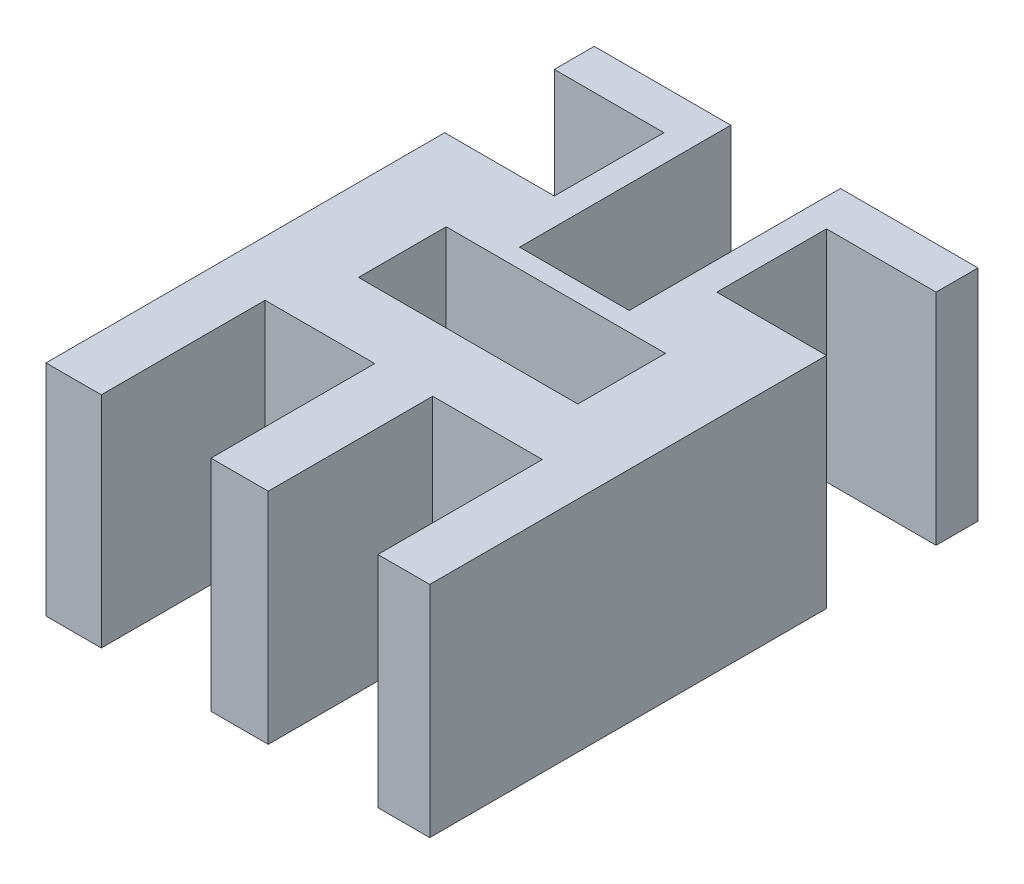
ISO-10303-21;
HEADER;
FILE_DESCRIPTION(('STEP AP214'),'2;1');
FILE_NAME('part.step','',(''),(''),'','','');
FILE_SCHEMA(('AUTOMOTIVE_DESIGN { 1 0 10303 214 1 1 1 1 }'));
ENDSEC;
DATA;
#1=APPLICATION_CONTEXT('core data for automotive mechanical design processes');
#2=APPLICATION_PROTOCOL_DEFINITION('international standard','automotive_design',2000,#1);
#3=PRODUCT_CONTEXT('',#1,'mechanical');
#4=PRODUCT('Part','Part','',(#3));
#5=PRODUCT_RELATED_PRODUCT_CATEGORY('part','',(#4));
#6=PRODUCT_DEFINITION_FORMATION('','',#4);
#7=PRODUCT_DEFINITION_CONTEXT('part definition',#1,'design');
#8=PRODUCT_DEFINITION('design','',#6,#7);
#9=PRODUCT_DEFINITION_SHAPE('','',#8);
#10=(LENGTH_UNIT() NAMED_UNIT(*) SI_UNIT(.MILLI.,.METRE.));
#11=(NAMED_UNIT(*) PLANE_ANGLE_UNIT() SI_UNIT($,.RADIAN.));
#12=(NAMED_UNIT(*) SI_UNIT($,.STERADIAN.) SOLID_ANGLE_UNIT());
#13=UNCERTAINTY_MEASURE_WITH_UNIT(LENGTH_MEASURE(1.E-05),#10,'distance_accuracy_value','');
#14=(GEOMETRIC_REPRESENTATION_CONTEXT(3) GLOBAL_UNCERTAINTY_ASSIGNED_CONTEXT((#13)) GLOBAL_UNIT_ASSIGNED_CONTEXT((#10,
#11,#12)) REPRESENTATION_CONTEXT('',''));
#15=CARTESIAN_POINT('',(0.,0.,0.));
#16=DIRECTION('',(0.,0.,1.));
#17=DIRECTION('',(1.,0.,0.));
#18=AXIS2_PLACEMENT_3D('',#15,#16,#17);
#19=CARTESIAN_POINT('',(-35.,40.,-50.));
#20=DIRECTION('',(0.,0.,-1.));
#21=DIRECTION('',(-1.,0.,0.));
#22=AXIS2_PLACEMENT_3D('',#19,#20,#21);
#23=PLANE('',#22);
#24=DIRECTION('',(1.,0.,0.));
#25=VECTOR('',#24,1.);
#26=CARTESIAN_POINT('',(-35.,0.,-50.));
#27=LINE('',#26,#25);
#28=CARTESIAN_POINT('',(9.90898636631014,0.,-50.));
#29=VERTEX_POINT('',#28);
#30=CARTESIAN_POINT('',(35.,0.,-50.));
#31=VERTEX_POINT('',#30);
#32=EDGE_CURVE('E403',#29,#31,#27,.T.);
#33=ORIENTED_EDGE('',*,*,#32,.F.);
#34=DIRECTION('',(0.,1.,0.));
#35=VECTOR('',#34,1.);
#36=CARTESIAN_POINT('',(9.90898636631014,40.,-50.));
#37=LINE('',#36,#35);
#38=CARTESIAN_POINT('',(9.90898636631014,40.,-50.));
#39=VERTEX_POINT('',#38);
#40=EDGE_CURVE('E44',#29,#39,#37,.T.);
#41=ORIENTED_EDGE('',*,*,#40,.T.);
#42=DIRECTION('',(1.,0.,0.));
#43=VECTOR('',#42,1.);
#44=CARTESIAN_POINT('',(-35.,40.,-50.));
#45=LINE('',#44,#43);
#46=CARTESIAN_POINT('',(35.,40.,-50.));
#47=VERTEX_POINT('',#46);
#48=EDGE_CURVE('E386',#39,#47,#45,.T.);
#49=ORIENTED_EDGE('',*,*,#48,.T.);
#50=DIRECTION('',(0.,-1.,0.));
#51=VECTOR('',#50,1.);
#52=CARTESIAN_POINT('',(35.,40.,-50.));
#53=LINE('',#52,#51);
#54=EDGE_CURVE('E414',#47,#31,#53,.T.);
#55=ORIENTED_EDGE('',*,*,#54,.T.);
#56=EDGE_LOOP('',(#33,#41,#49,#55));
#57=FACE_BOUND('',#56,.T.);
#58=ADVANCED_FACE('F36',(#57),#23,.T.);
#59=CARTESIAN_POINT('',(-35.,40.,50.));
#60=DIRECTION('',(0.,0.,-1.));
#61=DIRECTION('',(-1.,0.,0.));
#62=AXIS2_PLACEMENT_3D('',#59,#60,#61);
#63=PLANE('',#62);
#64=DIRECTION('',(1.,0.,0.));
#65=VECTOR('',#64,1.);
#66=CARTESIAN_POINT('',(-35.,0.,50.));
#67=LINE('',#66,#65);
#68=CARTESIAN_POINT('',(-4.90912933814225,0.,50.));
#69=VERTEX_POINT('',#68);
#70=CARTESIAN_POINT('',(5.53636865411646,0.,50.));
#71=VERTEX_POINT('',#70);
#72=EDGE_CURVE('E399',#69,#71,#67,.T.);
#73=ORIENTED_EDGE('',*,*,#72,.T.);
#74=DIRECTION('',(0.,1.,0.));
#75=VECTOR('',#74,1.);
#76=CARTESIAN_POINT('',(5.53636865411646,0.,50.));
#77=LINE('',#76,#75);
#78=CARTESIAN_POINT('',(5.53636865411646,40.,50.));
#79=VERTEX_POINT('',#78);
#80=EDGE_CURVE('E290',#71,#79,#77,.T.);
#81=ORIENTED_EDGE('',*,*,#80,.T.);
#82=DIRECTION('',(1.,0.,0.));
#83=VECTOR('',#82,1.);
#84=CARTESIAN_POINT('',(-35.,40.,50.));
#85=LINE('',#84,#83);
#86=CARTESIAN_POINT('',(-4.90912933814225,40.,50.));
#87=VERTEX_POINT('',#86);
#88=EDGE_CURVE('E381',#87,#79,#85,.T.);
#89=ORIENTED_EDGE('',*,*,#88,.F.);
#90=DIRECTION('',(0.,-1.,0.));
#91=VECTOR('',#90,1.);
#92=CARTESIAN_POINT('',(-4.90912933814225,40.,50.));
#93=LINE('',#92,#91);
#94=EDGE_CURVE('E420',#87,#69,#93,.T.);
#95=ORIENTED_EDGE('',*,*,#94,.T.);
#96=EDGE_LOOP('',(#73,#81,#89,#95));
#97=FACE_BOUND('',#96,.T.);
#98=ADVANCED_FACE('F461',(#97),#63,.F.);
#99=CARTESIAN_POINT('',(-35.,0.,50.));
#100=VERTEX_POINT('',#99);
#101=CARTESIAN_POINT('',(-24.9091293381423,0.,50.));
#102=VERTEX_POINT('',#101);
#103=EDGE_CURVE('E395',#100,#102,#67,.T.);
#104=ORIENTED_EDGE('',*,*,#103,.T.);
#105=DIRECTION('',(0.,1.,0.));
#106=VECTOR('',#105,1.);
#107=CARTESIAN_POINT('',(-24.9091293381423,40.,50.));
#108=LINE('',#107,#106);
#109=CARTESIAN_POINT('',(-24.9091293381423,40.,50.));
#110=VERTEX_POINT('',#109);
#111=EDGE_CURVE('E423',#102,#110,#108,.T.);
#112=ORIENTED_EDGE('',*,*,#111,.T.);
#113=CARTESIAN_POINT('',(-35.,40.,50.));
#114=VERTEX_POINT('',#113);
#115=EDGE_CURVE('E377',#114,#110,#85,.T.);
#116=ORIENTED_EDGE('',*,*,#115,.F.);
#117=DIRECTION('',(0.,-1.,0.));
#118=VECTOR('',#117,1.);
#119=CARTESIAN_POINT('',(-35.,40.,50.));
#120=LINE('',#119,#118);
#121=EDGE_CURVE('E394',#114,#100,#120,.T.);
#122=ORIENTED_EDGE('',*,*,#121,.T.);
#123=EDGE_LOOP('',(#104,#112,#116,#122));
#124=FACE_BOUND('',#123,.T.);
#125=ADVANCED_FACE('F494',(#124),#63,.F.);
#126=CARTESIAN_POINT('',(35.,40.,-50.));
#127=DIRECTION('',(1.,0.,0.));
#128=DIRECTION('',(0.,0.,-1.));
#129=AXIS2_PLACEMENT_3D('',#126,#127,#128);
#130=PLANE('',#129);
#131=DIRECTION('',(0.,0.,1.));
#132=VECTOR('',#131,1.);
#133=CARTESIAN_POINT('',(35.,0.,-50.));
#134=LINE('',#133,#132);
#135=CARTESIAN_POINT('',(35.,0.,-22.3539931340791));
#136=VERTEX_POINT('',#135);
#137=CARTESIAN_POINT('',(35.,0.,50.));
#138=VERTEX_POINT('',#137);
#139=EDGE_CURVE('E398',#136,#138,#134,.T.);
#140=ORIENTED_EDGE('',*,*,#139,.F.);
#141=DIRECTION('',(0.,1.,0.));
#142=VECTOR('',#141,1.);
#143=CARTESIAN_POINT('',(35.,40.,-22.3539931340791));
#144=LINE('',#143,#142);
#145=CARTESIAN_POINT('',(35.,40.,-22.3539931340791));
#146=VERTEX_POINT('',#145);
#147=EDGE_CURVE('E373',#136,#146,#144,.T.);
#148=ORIENTED_EDGE('',*,*,#147,.T.);
#149=DIRECTION('',(0.,0.,1.));
#150=VECTOR('',#149,1.);
#151=CARTESIAN_POINT('',(35.,40.,-50.));
#152=LINE('',#151,#150);
#153=CARTESIAN_POINT('',(35.,40.,50.));
#154=VERTEX_POINT('',#153);
#155=EDGE_CURVE('E380',#146,#154,#152,.T.);
#156=ORIENTED_EDGE('',*,*,#155,.T.);
#157=DIRECTION('',(0.,-1.,0.));
#158=VECTOR('',#157,1.);
#159=CARTESIAN_POINT('',(35.,40.,50.));
#160=LINE('',#159,#158);
#161=EDGE_CURVE('E417',#154,#138,#160,.T.);
#162=ORIENTED_EDGE('',*,*,#161,.T.);
#163=EDGE_LOOP('',(#140,#148,#156,#162));
#164=FACE_BOUND('',#163,.T.);
#165=ADVANCED_FACE('F451',(#164),#130,.T.);
#166=CARTESIAN_POINT('',(-35.,40.,-50.));
#167=DIRECTION('',(1.,0.,0.));
#168=DIRECTION('',(0.,0.,-1.));
#169=AXIS2_PLACEMENT_3D('',#166,#167,#168);
#170=PLANE('',#169);
#171=DIRECTION('',(0.,-1.,0.));
#172=VECTOR('',#171,1.);
#173=CARTESIAN_POINT('',(-35.,40.,-22.7192957665216));
#174=LINE('',#173,#172);
#175=CARTESIAN_POINT('',(-35.,40.,-22.7192957665216));
#176=VERTEX_POINT('',#175);
#177=CARTESIAN_POINT('',(-35.,0.,-22.7192957665216));
#178=VERTEX_POINT('',#177);
#179=EDGE_CURVE('E355',#176,#178,#174,.T.);
#180=ORIENTED_EDGE('',*,*,#179,.T.);
#181=DIRECTION('',(0.,0.,1.));
#182=VECTOR('',#181,1.);
#183=CARTESIAN_POINT('',(-35.,0.,-50.));
#184=LINE('',#183,#182);
#185=EDGE_CURVE('E406',#178,#100,#184,.T.);
#186=ORIENTED_EDGE('',*,*,#185,.T.);
#187=ORIENTED_EDGE('',*,*,#121,.F.);
#188=DIRECTION('',(0.,0.,1.));
#189=VECTOR('',#188,1.);
#190=CARTESIAN_POINT('',(-35.,40.,-50.));
#191=LINE('',#190,#189);
#192=EDGE_CURVE('E390',#176,#114,#191,.T.);
#193=ORIENTED_EDGE('',*,*,#192,.F.);
#194=EDGE_LOOP('',(#180,#186,#187,#193));
#195=FACE_BOUND('',#194,.T.);
#196=ADVANCED_FACE('F505',(#195),#170,.F.);
#197=CARTESIAN_POINT('',(0.,40.,0.));
#198=DIRECTION('',(0.,-1.,0.));
#199=DIRECTION('',(0.,0.,-1.));
#200=AXIS2_PLACEMENT_3D('',#197,#198,#199);
#201=PLANE('',#200);
#202=DIRECTION('',(-1.,0.,0.));
#203=VECTOR('',#202,1.);
#204=CARTESIAN_POINT('',(-20.,40.,-8.));
#205=LINE('',#204,#203);
#206=CARTESIAN_POINT('',(20.,40.,-8.));
#207=VERTEX_POINT('',#206);
#208=CARTESIAN_POINT('',(-20.,40.,-8.));
#209=VERTEX_POINT('',#208);
#210=EDGE_CURVE('E264',#207,#209,#205,.T.);
#211=ORIENTED_EDGE('',*,*,#210,.F.);
#212=DIRECTION('',(0.,0.,-1.));
#213=VECTOR('',#212,1.);
#214=CARTESIAN_POINT('',(20.,40.,-8.));
#215=LINE('',#214,#213);
#216=CARTESIAN_POINT('',(20.,40.,8.));
#217=VERTEX_POINT('',#216);
#218=EDGE_CURVE('E59',#217,#207,#215,.T.);
#219=ORIENTED_EDGE('',*,*,#218,.F.);
#220=DIRECTION('',(1.,0.,0.));
#221=VECTOR('',#220,1.);
#222=CARTESIAN_POINT('',(-20.,40.,8.));
#223=LINE('',#222,#221);
#224=CARTESIAN_POINT('',(-20.,40.,8.));
#225=VERTEX_POINT('',#224);
#226=EDGE_CURVE('E253',#225,#217,#223,.T.);
#227=ORIENTED_EDGE('',*,*,#226,.F.);
#228=DIRECTION('',(0.,0.,1.));
#229=VECTOR('',#228,1.);
#230=CARTESIAN_POINT('',(-20.,40.,-8.));
#231=LINE('',#230,#229);
#232=EDGE_CURVE('E267',#209,#225,#231,.T.);
#233=ORIENTED_EDGE('',*,*,#232,.F.);
#234=EDGE_LOOP('',(#211,#219,#227,#233));
#235=FACE_BOUND('',#234,.T.);
#236=DIRECTION('',(1.,0.,0.));
#237=VECTOR('',#236,1.);
#238=CARTESIAN_POINT('',(-10.0910136336899,40.,-11.4659918373604));
#239=LINE('',#238,#237);
#240=CARTESIAN_POINT('',(-10.0910136336899,40.,-11.4659918373604));
#241=VERTEX_POINT('',#240);
#242=CARTESIAN_POINT('',(9.90898636631015,40.,-11.4659918373604));
#243=VERTEX_POINT('',#242);
#244=EDGE_CURVE('E235',#241,#243,#239,.T.);
#245=ORIENTED_EDGE('',*,*,#244,.F.);
#246=DIRECTION('',(0.,0.,1.));
#247=VECTOR('',#246,1.);
#248=CARTESIAN_POINT('',(-10.0910136336899,40.,-51.4659918373604));
#249=LINE('',#248,#247);
#250=CARTESIAN_POINT('',(-10.0910136336899,40.,-50.));
#251=VERTEX_POINT('',#250);
#252=EDGE_CURVE('E241',#251,#241,#249,.T.);
#253=ORIENTED_EDGE('',*,*,#252,.F.);
#254=CARTESIAN_POINT('',(-35.,40.,-50.));
#255=VERTEX_POINT('',#254);
#256=EDGE_CURVE('E387',#255,#251,#45,.T.);
#257=ORIENTED_EDGE('',*,*,#256,.F.);
#258=CARTESIAN_POINT('',(-35.,40.,-42.7192957665216));
#259=VERTEX_POINT('',#258);
#260=EDGE_CURVE('E391',#255,#259,#191,.T.);
#261=ORIENTED_EDGE('',*,*,#260,.T.);
#262=DIRECTION('',(1.,0.,0.));
#263=VECTOR('',#262,1.);
#264=CARTESIAN_POINT('',(-35.,40.,-42.7192957665216));
#265=LINE('',#264,#263);
#266=CARTESIAN_POINT('',(-15.,40.,-42.7192957665216));
#267=VERTEX_POINT('',#266);
#268=EDGE_CURVE('E363',#259,#267,#265,.T.);
#269=ORIENTED_EDGE('',*,*,#268,.T.);
#270=DIRECTION('',(0.,0.,-1.));
#271=VECTOR('',#270,1.);
#272=CARTESIAN_POINT('',(-15.,40.,-22.7192957665216));
#273=LINE('',#272,#271);
#274=CARTESIAN_POINT('',(-15.,40.,-22.7192957665216));
#275=VERTEX_POINT('',#274);
#276=EDGE_CURVE('E368',#275,#267,#273,.T.);
#277=ORIENTED_EDGE('',*,*,#276,.F.);
#278=DIRECTION('',(1.,0.,0.));
#279=VECTOR('',#278,1.);
#280=CARTESIAN_POINT('',(-35.,40.,-22.7192957665216));
#281=LINE('',#280,#279);
#282=EDGE_CURVE('E352',#176,#275,#281,.T.);
#283=ORIENTED_EDGE('',*,*,#282,.F.);
#284=ORIENTED_EDGE('',*,*,#192,.T.);
#285=ORIENTED_EDGE('',*,*,#115,.T.);
#286=DIRECTION('',(0.,0.,1.));
#287=VECTOR('',#286,1.);
#288=CARTESIAN_POINT('',(-24.9091293381423,40.,20.124839846087));
#289=LINE('',#288,#287);
#290=CARTESIAN_POINT('',(-24.9091293381423,40.,20.124839846087));
#291=VERTEX_POINT('',#290);
#292=EDGE_CURVE('E274',#291,#110,#289,.T.);
#293=ORIENTED_EDGE('',*,*,#292,.F.);
#294=DIRECTION('',(-1.,0.,0.));
#295=VECTOR('',#294,1.);
#296=CARTESIAN_POINT('',(-24.9091293381423,40.,20.124839846087));
#297=LINE('',#296,#295);
#298=CARTESIAN_POINT('',(-4.90912933814225,40.,20.124839846087));
#299=VERTEX_POINT('',#298);
#300=EDGE_CURVE('E312',#299,#291,#297,.T.);
#301=ORIENTED_EDGE('',*,*,#300,.F.);
#302=DIRECTION('',(0.,0.,-1.));
#303=VECTOR('',#302,1.);
#304=CARTESIAN_POINT('',(-4.90912933814225,40.,20.124839846087));
#305=LINE('',#304,#303);
#306=EDGE_CURVE('E320',#87,#299,#305,.T.);
#307=ORIENTED_EDGE('',*,*,#306,.F.);
#308=ORIENTED_EDGE('',*,*,#88,.T.);
#309=DIRECTION('',(0.,0.,1.));
#310=VECTOR('',#309,1.);
#311=CARTESIAN_POINT('',(5.53636865411646,40.,20.));
#312=LINE('',#311,#310);
#313=CARTESIAN_POINT('',(5.53636865411646,40.,20.));
#314=VERTEX_POINT('',#313);
#315=EDGE_CURVE('E291',#314,#79,#312,.T.);
#316=ORIENTED_EDGE('',*,*,#315,.F.);
#317=DIRECTION('',(-1.,0.,0.));
#318=VECTOR('',#317,1.);
#319=CARTESIAN_POINT('',(5.53636865411646,40.,20.));
#320=LINE('',#319,#318);
#321=CARTESIAN_POINT('',(25.5363686541165,40.,20.));
#322=VERTEX_POINT('',#321);
#323=EDGE_CURVE('E284',#322,#314,#320,.T.);
#324=ORIENTED_EDGE('',*,*,#323,.F.);
#325=DIRECTION('',(0.,0.,-1.));
#326=VECTOR('',#325,1.);
#327=CARTESIAN_POINT('',(25.5363686541165,40.,20.));
#328=LINE('',#327,#326);
#329=CARTESIAN_POINT('',(25.5363686541165,40.,50.));
#330=VERTEX_POINT('',#329);
#331=EDGE_CURVE('E293',#330,#322,#328,.T.);
#332=ORIENTED_EDGE('',*,*,#331,.F.);
#333=EDGE_CURVE('E382',#330,#154,#85,.T.);
#334=ORIENTED_EDGE('',*,*,#333,.T.);
#335=ORIENTED_EDGE('',*,*,#155,.F.);
#336=DIRECTION('',(1.,0.,0.));
#337=VECTOR('',#336,1.);
#338=CARTESIAN_POINT('',(15.0076458781553,40.,-22.3539931340791));
#339=LINE('',#338,#337);
#340=CARTESIAN_POINT('',(15.0076458781553,40.,-22.3539931340791));
#341=VERTEX_POINT('',#340);
#342=EDGE_CURVE('E334',#341,#146,#339,.T.);
#343=ORIENTED_EDGE('',*,*,#342,.F.);
#344=DIRECTION('',(0.,0.,-1.));
#345=VECTOR('',#344,1.);
#346=CARTESIAN_POINT('',(15.0076458781553,40.,-22.3539931340791));
#347=LINE('',#346,#345);
#348=CARTESIAN_POINT('',(15.0076458781553,40.,-42.3539931340791));
#349=VERTEX_POINT('',#348);
#350=EDGE_CURVE('E327',#341,#349,#347,.T.);
#351=ORIENTED_EDGE('',*,*,#350,.T.);
#352=DIRECTION('',(1.,0.,0.));
#353=VECTOR('',#352,1.);
#354=CARTESIAN_POINT('',(15.0076458781553,40.,-42.3539931340791));
#355=LINE('',#354,#353);
#356=CARTESIAN_POINT('',(35.,40.,-42.3539931340791));
#357=VERTEX_POINT('',#356);
#358=EDGE_CURVE('E330',#349,#357,#355,.T.);
#359=ORIENTED_EDGE('',*,*,#358,.T.);
#360=EDGE_CURVE('E383',#47,#357,#152,.T.);
#361=ORIENTED_EDGE('',*,*,#360,.F.);
#362=ORIENTED_EDGE('',*,*,#48,.F.);
#363=DIRECTION('',(0.,0.,1.));
#364=VECTOR('',#363,1.);
#365=CARTESIAN_POINT('',(9.90898636631014,40.,-51.4659918373604));
#366=LINE('',#365,#364);
#367=EDGE_CURVE('E51',#39,#243,#366,.T.);
#368=ORIENTED_EDGE('',*,*,#367,.T.);
#369=EDGE_LOOP('',(#245,#253,#257,#261,#269,#277,#283,#284,#285,#293,#301,#307,#308,#316,#324,
#332,#334,#335,#343,#351,#359,#361,#362,#368));
#370=FACE_BOUND('',#369,.T.);
#371=ADVANCED_FACE('F430',(#235,#370),#201,.F.);
#372=CARTESIAN_POINT('',(0.,0.,0.));
#373=DIRECTION('',(0.,-1.,0.));
#374=DIRECTION('',(0.,0.,-1.));
#375=AXIS2_PLACEMENT_3D('',#372,#373,#374);
#376=PLANE('',#375);
#377=DIRECTION('',(0.,0.,1.));
#378=VECTOR('',#377,1.);
#379=CARTESIAN_POINT('',(-10.0910136336899,0.,-51.4659918373604));
#380=LINE('',#379,#378);
#381=CARTESIAN_POINT('',(-10.0910136336899,0.,-50.));
#382=VERTEX_POINT('',#381);
#383=CARTESIAN_POINT('',(-10.0910136336899,0.,-11.4659918373604));
#384=VERTEX_POINT('',#383);
#385=EDGE_CURVE('E226',#382,#384,#380,.T.);
#386=ORIENTED_EDGE('',*,*,#385,.T.);
#387=DIRECTION('',(1.,0.,0.));
#388=VECTOR('',#387,1.);
#389=CARTESIAN_POINT('',(-10.0910136336899,0.,-11.4659918373604));
#390=LINE('',#389,#388);
#391=CARTESIAN_POINT('',(9.90898636631015,0.,-11.4659918373604));
#392=VERTEX_POINT('',#391);
#393=EDGE_CURVE('E227',#384,#392,#390,.T.);
#394=ORIENTED_EDGE('',*,*,#393,.T.);
#395=DIRECTION('',(0.,0.,1.));
#396=VECTOR('',#395,1.);
#397=CARTESIAN_POINT('',(9.90898636631014,0.,-51.4659918373604));
#398=LINE('',#397,#396);
#399=EDGE_CURVE('E218',#29,#392,#398,.T.);
#400=ORIENTED_EDGE('',*,*,#399,.F.);
#401=ORIENTED_EDGE('',*,*,#32,.T.);
#402=CARTESIAN_POINT('',(35.,0.,-42.3539931340791));
#403=VERTEX_POINT('',#402);
#404=EDGE_CURVE('E400',#31,#403,#134,.T.);
#405=ORIENTED_EDGE('',*,*,#404,.T.);
#406=DIRECTION('',(1.,0.,0.));
#407=VECTOR('',#406,1.);
#408=CARTESIAN_POINT('',(15.0076458781553,0.,-42.3539931340791));
#409=LINE('',#408,#407);
#410=CARTESIAN_POINT('',(15.0076458781553,0.,-42.3539931340791));
#411=VERTEX_POINT('',#410);
#412=EDGE_CURVE('E339',#411,#403,#409,.T.);
#413=ORIENTED_EDGE('',*,*,#412,.F.);
#414=DIRECTION('',(0.,0.,-1.));
#415=VECTOR('',#414,1.);
#416=CARTESIAN_POINT('',(15.0076458781553,0.,-22.3539931340791));
#417=LINE('',#416,#415);
#418=CARTESIAN_POINT('',(15.0076458781553,0.,-22.3539931340791));
#419=VERTEX_POINT('',#418);
#420=EDGE_CURVE('E337',#419,#411,#417,.T.);
#421=ORIENTED_EDGE('',*,*,#420,.F.);
#422=DIRECTION('',(1.,0.,0.));
#423=VECTOR('',#422,1.);
#424=CARTESIAN_POINT('',(15.0076458781553,0.,-22.3539931340791));
#425=LINE('',#424,#423);
#426=EDGE_CURVE('E331',#419,#136,#425,.T.);
#427=ORIENTED_EDGE('',*,*,#426,.T.);
#428=ORIENTED_EDGE('',*,*,#139,.T.);
#429=CARTESIAN_POINT('',(25.5363686541165,0.,50.));
#430=VERTEX_POINT('',#429);
#431=EDGE_CURVE('E376',#430,#138,#67,.T.);
#432=ORIENTED_EDGE('',*,*,#431,.F.);
#433=DIRECTION('',(0.,0.,-1.));
#434=VECTOR('',#433,1.);
#435=CARTESIAN_POINT('',(25.5363686541165,0.,20.));
#436=LINE('',#435,#434);
#437=CARTESIAN_POINT('',(25.5363686541165,0.,20.));
#438=VERTEX_POINT('',#437);
#439=EDGE_CURVE('E283',#430,#438,#436,.T.);
#440=ORIENTED_EDGE('',*,*,#439,.T.);
#441=DIRECTION('',(-1.,0.,0.));
#442=VECTOR('',#441,1.);
#443=CARTESIAN_POINT('',(5.53636865411646,0.,20.));
#444=LINE('',#443,#442);
#445=CARTESIAN_POINT('',(5.53636865411646,0.,20.));
#446=VERTEX_POINT('',#445);
#447=EDGE_CURVE('E287',#438,#446,#444,.T.);
#448=ORIENTED_EDGE('',*,*,#447,.T.);
#449=DIRECTION('',(0.,0.,1.));
#450=VECTOR('',#449,1.);
#451=CARTESIAN_POINT('',(5.53636865411646,0.,20.));
#452=LINE('',#451,#450);
#453=EDGE_CURVE('E280',#446,#71,#452,.T.);
#454=ORIENTED_EDGE('',*,*,#453,.T.);
#455=ORIENTED_EDGE('',*,*,#72,.F.);
#456=DIRECTION('',(0.,0.,-1.));
#457=VECTOR('',#456,1.);
#458=CARTESIAN_POINT('',(-4.90912933814225,0.,20.124839846087));
#459=LINE('',#458,#457);
#460=CARTESIAN_POINT('',(-4.90912933814225,0.,20.124839846087));
#461=VERTEX_POINT('',#460);
#462=EDGE_CURVE('E311',#69,#461,#459,.T.);
#463=ORIENTED_EDGE('',*,*,#462,.T.);
#464=DIRECTION('',(-1.,0.,0.));
#465=VECTOR('',#464,1.);
#466=CARTESIAN_POINT('',(-24.9091293381423,0.,20.124839846087));
#467=LINE('',#466,#465);
#468=CARTESIAN_POINT('',(-24.9091293381423,0.,20.124839846087));
#469=VERTEX_POINT('',#468);
#470=EDGE_CURVE('E315',#461,#469,#467,.T.);
#471=ORIENTED_EDGE('',*,*,#470,.T.);
#472=DIRECTION('',(0.,0.,1.));
#473=VECTOR('',#472,1.);
#474=CARTESIAN_POINT('',(-24.9091293381423,0.,20.124839846087));
#475=LINE('',#474,#473);
#476=EDGE_CURVE('E308',#469,#102,#475,.T.);
#477=ORIENTED_EDGE('',*,*,#476,.T.);
#478=ORIENTED_EDGE('',*,*,#103,.F.);
#479=ORIENTED_EDGE('',*,*,#185,.F.);
#480=DIRECTION('',(1.,0.,0.));
#481=VECTOR('',#480,1.);
#482=CARTESIAN_POINT('',(-35.,0.,-22.7192957665216));
#483=LINE('',#482,#481);
#484=CARTESIAN_POINT('',(-15.,0.,-22.7192957665216));
#485=VERTEX_POINT('',#484);
#486=EDGE_CURVE('E359',#178,#485,#483,.T.);
#487=ORIENTED_EDGE('',*,*,#486,.T.);
#488=DIRECTION('',(0.,0.,-1.));
#489=VECTOR('',#488,1.);
#490=CARTESIAN_POINT('',(-15.,0.,-22.7192957665216));
#491=LINE('',#490,#489);
#492=CARTESIAN_POINT('',(-15.,0.,-42.7192957665216));
#493=VERTEX_POINT('',#492);
#494=EDGE_CURVE('E362',#485,#493,#491,.T.);
#495=ORIENTED_EDGE('',*,*,#494,.T.);
#496=DIRECTION('',(1.,0.,0.));
#497=VECTOR('',#496,1.);
#498=CARTESIAN_POINT('',(-35.,0.,-42.7192957665216));
#499=LINE('',#498,#497);
#500=CARTESIAN_POINT('',(-35.,0.,-42.7192957665216));
#501=VERTEX_POINT('',#500);
#502=EDGE_CURVE('E340',#501,#493,#499,.T.);
#503=ORIENTED_EDGE('',*,*,#502,.F.);
#504=CARTESIAN_POINT('',(-35.,0.,-50.));
#505=VERTEX_POINT('',#504);
#506=EDGE_CURVE('E407',#505,#501,#184,.T.);
#507=ORIENTED_EDGE('',*,*,#506,.F.);
#508=EDGE_CURVE('E404',#505,#382,#27,.T.);
#509=ORIENTED_EDGE('',*,*,#508,.T.);
#510=EDGE_LOOP('',(#386,#394,#400,#401,#405,#413,#421,#427,#428,#432,#440,#448,#454,#455,#463,
#471,#477,#478,#479,#487,#495,#503,#507,#509));
#511=FACE_BOUND('',#510,.T.);
#512=DIRECTION('',(0.,0.,-1.));
#513=VECTOR('',#512,1.);
#514=CARTESIAN_POINT('',(20.,0.,-8.));
#515=LINE('',#514,#513);
#516=CARTESIAN_POINT('',(20.,0.,8.));
#517=VERTEX_POINT('',#516);
#518=CARTESIAN_POINT('',(20.,0.,-8.));
#519=VERTEX_POINT('',#518);
#520=EDGE_CURVE('E249',#517,#519,#515,.T.);
#521=ORIENTED_EDGE('',*,*,#520,.T.);
#522=DIRECTION('',(-1.,0.,0.));
#523=VECTOR('',#522,1.);
#524=CARTESIAN_POINT('',(-20.,0.,-8.));
#525=LINE('',#524,#523);
#526=CARTESIAN_POINT('',(-20.,0.,-8.));
#527=VERTEX_POINT('',#526);
#528=EDGE_CURVE('E252',#519,#527,#525,.T.);
#529=ORIENTED_EDGE('',*,*,#528,.T.);
#530=DIRECTION('',(0.,0.,1.));
#531=VECTOR('',#530,1.);
#532=CARTESIAN_POINT('',(-20.,0.,-8.));
#533=LINE('',#532,#531);
#534=CARTESIAN_POINT('',(-20.,0.,8.));
#535=VERTEX_POINT('',#534);
#536=EDGE_CURVE('E256',#527,#535,#533,.T.);
#537=ORIENTED_EDGE('',*,*,#536,.T.);
#538=DIRECTION('',(1.,0.,0.));
#539=VECTOR('',#538,1.);
#540=CARTESIAN_POINT('',(-20.,0.,8.));
#541=LINE('',#540,#539);
#542=EDGE_CURVE('E259',#535,#517,#541,.T.);
#543=ORIENTED_EDGE('',*,*,#542,.T.);
#544=EDGE_LOOP('',(#521,#529,#537,#543));
#545=FACE_BOUND('',#544,.T.);
#546=ADVANCED_FACE('F238',(#511,#545),#376,.T.);
#547=ORIENTED_EDGE('',*,*,#333,.F.);
#548=DIRECTION('',(0.,1.,0.));
#549=VECTOR('',#548,1.);
#550=CARTESIAN_POINT('',(25.5363686541165,0.,50.));
#551=LINE('',#550,#549);
#552=EDGE_CURVE('E304',#430,#330,#551,.T.);
#553=ORIENTED_EDGE('',*,*,#552,.F.);
#554=ORIENTED_EDGE('',*,*,#431,.T.);
#555=ORIENTED_EDGE('',*,*,#161,.F.);
#556=EDGE_LOOP('',(#547,#553,#554,#555));
#557=FACE_BOUND('',#556,.T.);
#558=ADVANCED_FACE('F38',(#557),#63,.F.);
#559=DIRECTION('',(0.,1.,0.));
#560=VECTOR('',#559,1.);
#561=CARTESIAN_POINT('',(35.,40.,-42.3539931340791));
#562=LINE('',#561,#560);
#563=EDGE_CURVE('E346',#403,#357,#562,.T.);
#564=ORIENTED_EDGE('',*,*,#563,.F.);
#565=ORIENTED_EDGE('',*,*,#404,.F.);
#566=ORIENTED_EDGE('',*,*,#54,.F.);
#567=ORIENTED_EDGE('',*,*,#360,.T.);
#568=EDGE_LOOP('',(#564,#565,#566,#567));
#569=FACE_BOUND('',#568,.T.);
#570=ADVANCED_FACE('F434',(#569),#130,.T.);
#571=DIRECTION('',(0.,1.,0.));
#572=VECTOR('',#571,1.);
#573=CARTESIAN_POINT('',(-10.0910136336899,40.,-50.));
#574=LINE('',#573,#572);
#575=EDGE_CURVE('E11',#382,#251,#574,.T.);
#576=ORIENTED_EDGE('',*,*,#575,.F.);
#577=ORIENTED_EDGE('',*,*,#508,.F.);
#578=DIRECTION('',(0.,-1.,0.));
#579=VECTOR('',#578,1.);
#580=CARTESIAN_POINT('',(-35.,40.,-50.));
#581=LINE('',#580,#579);
#582=EDGE_CURVE('E412',#255,#505,#581,.T.);
#583=ORIENTED_EDGE('',*,*,#582,.F.);
#584=ORIENTED_EDGE('',*,*,#256,.T.);
#585=EDGE_LOOP('',(#576,#577,#583,#584));
#586=FACE_BOUND('',#585,.T.);
#587=ADVANCED_FACE('F490',(#586),#23,.T.);
#588=ORIENTED_EDGE('',*,*,#506,.T.);
#589=DIRECTION('',(0.,-1.,0.));
#590=VECTOR('',#589,1.);
#591=CARTESIAN_POINT('',(-35.,40.,-42.7192957665216));
#592=LINE('',#591,#590);
#593=EDGE_CURVE('E301',#259,#501,#592,.T.);
#594=ORIENTED_EDGE('',*,*,#593,.F.);
#595=ORIENTED_EDGE('',*,*,#260,.F.);
#596=ORIENTED_EDGE('',*,*,#582,.T.);
#597=EDGE_LOOP('',(#588,#594,#595,#596));
#598=FACE_BOUND('',#597,.T.);
#599=ADVANCED_FACE('F497',(#598),#170,.F.);
#600=CARTESIAN_POINT('',(-35.,40.,-42.7192957665216));
#601=DIRECTION('',(0.,0.,-1.));
#602=DIRECTION('',(-1.,0.,0.));
#603=AXIS2_PLACEMENT_3D('',#600,#601,#602);
#604=PLANE('',#603);
#605=ORIENTED_EDGE('',*,*,#502,.T.);
#606=DIRECTION('',(0.,-1.,0.));
#607=VECTOR('',#606,1.);
#608=CARTESIAN_POINT('',(-15.,40.,-42.7192957665216));
#609=LINE('',#608,#607);
#610=EDGE_CURVE('E349',#267,#493,#609,.T.);
#611=ORIENTED_EDGE('',*,*,#610,.F.);
#612=ORIENTED_EDGE('',*,*,#268,.F.);
#613=ORIENTED_EDGE('',*,*,#593,.T.);
#614=EDGE_LOOP('',(#605,#611,#612,#613));
#615=FACE_BOUND('',#614,.T.);
#616=ADVANCED_FACE('F503',(#615),#604,.F.);
#617=CARTESIAN_POINT('',(-35.,40.,-22.7192957665216));
#618=DIRECTION('',(0.,0.,-1.));
#619=DIRECTION('',(-1.,0.,0.));
#620=AXIS2_PLACEMENT_3D('',#617,#618,#619);
#621=PLANE('',#620);
#622=ORIENTED_EDGE('',*,*,#486,.F.);
#623=ORIENTED_EDGE('',*,*,#179,.F.);
#624=ORIENTED_EDGE('',*,*,#282,.T.);
#625=DIRECTION('',(0.,-1.,0.));
#626=VECTOR('',#625,1.);
#627=CARTESIAN_POINT('',(-15.,40.,-22.7192957665216));
#628=LINE('',#627,#626);
#629=EDGE_CURVE('E353',#275,#485,#628,.T.);
#630=ORIENTED_EDGE('',*,*,#629,.T.);
#631=EDGE_LOOP('',(#622,#623,#624,#630));
#632=FACE_BOUND('',#631,.T.);
#633=ADVANCED_FACE('F689',(#632),#621,.T.);
#634=CARTESIAN_POINT('',(-15.,40.,-22.7192957665216));
#635=DIRECTION('',(-1.,0.,0.));
#636=DIRECTION('',(0.,0.,1.));
#637=AXIS2_PLACEMENT_3D('',#634,#635,#636);
#638=PLANE('',#637);
#639=ORIENTED_EDGE('',*,*,#494,.F.);
#640=ORIENTED_EDGE('',*,*,#629,.F.);
#641=ORIENTED_EDGE('',*,*,#276,.T.);
#642=ORIENTED_EDGE('',*,*,#610,.T.);
#643=EDGE_LOOP('',(#639,#640,#641,#642));
#644=FACE_BOUND('',#643,.T.);
#645=ADVANCED_FACE('F681',(#644),#638,.T.);
#646=CARTESIAN_POINT('',(15.0076458781553,40.,-22.3539931340791));
#647=DIRECTION('',(-1.,0.,0.));
#648=DIRECTION('',(0.,0.,1.));
#649=AXIS2_PLACEMENT_3D('',#646,#647,#648);
#650=PLANE('',#649);
#651=ORIENTED_EDGE('',*,*,#420,.T.);
#652=DIRECTION('',(0.,-1.,0.));
#653=VECTOR('',#652,1.);
#654=CARTESIAN_POINT('',(15.0076458781553,40.,-42.3539931340791));
#655=LINE('',#654,#653);
#656=EDGE_CURVE('E336',#349,#411,#655,.T.);
#657=ORIENTED_EDGE('',*,*,#656,.F.);
#658=ORIENTED_EDGE('',*,*,#350,.F.);
#659=DIRECTION('',(0.,-1.,0.));
#660=VECTOR('',#659,1.);
#661=CARTESIAN_POINT('',(15.0076458781553,40.,-22.3539931340791));
#662=LINE('',#661,#660);
#663=EDGE_CURVE('E344',#341,#419,#662,.T.);
#664=ORIENTED_EDGE('',*,*,#663,.T.);
#665=EDGE_LOOP('',(#651,#657,#658,#664));
#666=FACE_BOUND('',#665,.T.);
#667=ADVANCED_FACE('F442',(#666),#650,.F.);
#668=CARTESIAN_POINT('',(15.0076458781553,40.,-22.3539931340791));
#669=DIRECTION('',(0.,0.,-1.));
#670=DIRECTION('',(-1.,0.,0.));
#671=AXIS2_PLACEMENT_3D('',#668,#669,#670);
#672=PLANE('',#671);
#673=ORIENTED_EDGE('',*,*,#426,.F.);
#674=ORIENTED_EDGE('',*,*,#663,.F.);
#675=ORIENTED_EDGE('',*,*,#342,.T.);
#676=ORIENTED_EDGE('',*,*,#147,.F.);
#677=EDGE_LOOP('',(#673,#674,#675,#676));
#678=FACE_BOUND('',#677,.T.);
#679=ADVANCED_FACE('F446',(#678),#672,.T.);
#680=CARTESIAN_POINT('',(15.0076458781553,40.,-42.3539931340791));
#681=DIRECTION('',(0.,0.,-1.));
#682=DIRECTION('',(-1.,0.,0.));
#683=AXIS2_PLACEMENT_3D('',#680,#681,#682);
#684=PLANE('',#683);
#685=ORIENTED_EDGE('',*,*,#563,.T.);
#686=ORIENTED_EDGE('',*,*,#358,.F.);
#687=ORIENTED_EDGE('',*,*,#656,.T.);
#688=ORIENTED_EDGE('',*,*,#412,.T.);
#689=EDGE_LOOP('',(#685,#686,#687,#688));
#690=FACE_BOUND('',#689,.T.);
#691=ADVANCED_FACE('F439',(#690),#684,.F.);
#692=CARTESIAN_POINT('',(-24.9091293381423,0.,20.124839846087));
#693=DIRECTION('',(-1.,0.,0.));
#694=DIRECTION('',(0.,0.,1.));
#695=AXIS2_PLACEMENT_3D('',#692,#693,#694);
#696=PLANE('',#695);
#697=ORIENTED_EDGE('',*,*,#476,.F.);
#698=DIRECTION('',(0.,1.,0.));
#699=VECTOR('',#698,1.);
#700=CARTESIAN_POINT('',(-24.9091293381423,0.,20.124839846087));
#701=LINE('',#700,#699);
#702=EDGE_CURVE('E294',#469,#291,#701,.T.);
#703=ORIENTED_EDGE('',*,*,#702,.T.);
#704=ORIENTED_EDGE('',*,*,#292,.T.);
#705=ORIENTED_EDGE('',*,*,#111,.F.);
#706=EDGE_LOOP('',(#697,#703,#704,#705));
#707=FACE_BOUND('',#706,.T.);
#708=ADVANCED_FACE('F637',(#707),#696,.F.);
#709=CARTESIAN_POINT('',(-4.90912933814225,0.,20.124839846087));
#710=DIRECTION('',(1.,0.,0.));
#711=DIRECTION('',(0.,0.,-1.));
#712=AXIS2_PLACEMENT_3D('',#709,#710,#711);
#713=PLANE('',#712);
#714=ORIENTED_EDGE('',*,*,#306,.T.);
#715=DIRECTION('',(0.,1.,0.));
#716=VECTOR('',#715,1.);
#717=CARTESIAN_POINT('',(-4.90912933814225,0.,20.124839846087));
#718=LINE('',#717,#716);
#719=EDGE_CURVE('E318',#461,#299,#718,.T.);
#720=ORIENTED_EDGE('',*,*,#719,.F.);
#721=ORIENTED_EDGE('',*,*,#462,.F.);
#722=ORIENTED_EDGE('',*,*,#94,.F.);
#723=EDGE_LOOP('',(#714,#720,#721,#722));
#724=FACE_BOUND('',#723,.T.);
#725=ADVANCED_FACE('F628',(#724),#713,.F.);
#726=CARTESIAN_POINT('',(-24.9091293381423,0.,20.124839846087));
#727=DIRECTION('',(0.,0.,-1.));
#728=DIRECTION('',(-1.,0.,0.));
#729=AXIS2_PLACEMENT_3D('',#726,#727,#728);
#730=PLANE('',#729);
#731=ORIENTED_EDGE('',*,*,#300,.T.);
#732=ORIENTED_EDGE('',*,*,#702,.F.);
#733=ORIENTED_EDGE('',*,*,#470,.F.);
#734=ORIENTED_EDGE('',*,*,#719,.T.);
#735=EDGE_LOOP('',(#731,#732,#733,#734));
#736=FACE_BOUND('',#735,.T.);
#737=ADVANCED_FACE('F485',(#736),#730,.F.);
#738=CARTESIAN_POINT('',(5.53636865411646,0.,20.));
#739=DIRECTION('',(-1.,0.,0.));
#740=DIRECTION('',(0.,0.,1.));
#741=AXIS2_PLACEMENT_3D('',#738,#739,#740);
#742=PLANE('',#741);
#743=ORIENTED_EDGE('',*,*,#315,.T.);
#744=ORIENTED_EDGE('',*,*,#80,.F.);
#745=ORIENTED_EDGE('',*,*,#453,.F.);
#746=DIRECTION('',(0.,1.,0.));
#747=VECTOR('',#746,1.);
#748=CARTESIAN_POINT('',(5.53636865411646,0.,20.));
#749=LINE('',#748,#747);
#750=EDGE_CURVE('E299',#446,#314,#749,.T.);
#751=ORIENTED_EDGE('',*,*,#750,.T.);
#752=EDGE_LOOP('',(#743,#744,#745,#751));
#753=FACE_BOUND('',#752,.T.);
#754=ADVANCED_FACE('F467',(#753),#742,.F.);
#755=CARTESIAN_POINT('',(5.53636865411646,0.,20.));
#756=DIRECTION('',(0.,0.,-1.));
#757=DIRECTION('',(-1.,0.,0.));
#758=AXIS2_PLACEMENT_3D('',#755,#756,#757);
#759=PLANE('',#758);
#760=ORIENTED_EDGE('',*,*,#323,.T.);
#761=ORIENTED_EDGE('',*,*,#750,.F.);
#762=ORIENTED_EDGE('',*,*,#447,.F.);
#763=DIRECTION('',(0.,1.,0.));
#764=VECTOR('',#763,1.);
#765=CARTESIAN_POINT('',(25.5363686541165,0.,20.));
#766=LINE('',#765,#764);
#767=EDGE_CURVE('E302',#438,#322,#766,.T.);
#768=ORIENTED_EDGE('',*,*,#767,.T.);
#769=EDGE_LOOP('',(#760,#761,#762,#768));
#770=FACE_BOUND('',#769,.T.);
#771=ADVANCED_FACE('F476',(#770),#759,.F.);
#772=CARTESIAN_POINT('',(25.5363686541165,0.,20.));
#773=DIRECTION('',(1.,0.,0.));
#774=DIRECTION('',(0.,0.,-1.));
#775=AXIS2_PLACEMENT_3D('',#772,#773,#774);
#776=PLANE('',#775);
#777=ORIENTED_EDGE('',*,*,#331,.T.);
#778=ORIENTED_EDGE('',*,*,#767,.F.);
#779=ORIENTED_EDGE('',*,*,#439,.F.);
#780=ORIENTED_EDGE('',*,*,#552,.T.);
#781=EDGE_LOOP('',(#777,#778,#779,#780));
#782=FACE_BOUND('',#781,.T.);
#783=ADVANCED_FACE('F474',(#782),#776,.F.);
#784=CARTESIAN_POINT('',(20.,0.,-8.));
#785=DIRECTION('',(1.,0.,0.));
#786=DIRECTION('',(0.,0.,-1.));
#787=AXIS2_PLACEMENT_3D('',#784,#785,#786);
#788=PLANE('',#787);
#789=ORIENTED_EDGE('',*,*,#218,.T.);
#790=DIRECTION('',(0.,1.,0.));
#791=VECTOR('',#790,1.);
#792=CARTESIAN_POINT('',(20.,0.,-8.));
#793=LINE('',#792,#791);
#794=EDGE_CURVE('E262',#519,#207,#793,.T.);
#795=ORIENTED_EDGE('',*,*,#794,.F.);
#796=ORIENTED_EDGE('',*,*,#520,.F.);
#797=DIRECTION('',(0.,1.,0.));
#798=VECTOR('',#797,1.);
#799=CARTESIAN_POINT('',(20.,0.,8.));
#800=LINE('',#799,#798);
#801=EDGE_CURVE('E272',#517,#217,#800,.T.);
#802=ORIENTED_EDGE('',*,*,#801,.T.);
#803=EDGE_LOOP('',(#789,#795,#796,#802));
#804=FACE_BOUND('',#803,.T.);
#805=ADVANCED_FACE('F483',(#804),#788,.F.);
#806=CARTESIAN_POINT('',(-20.,0.,8.));
#807=DIRECTION('',(0.,0.,1.));
#808=DIRECTION('',(1.,0.,0.));
#809=AXIS2_PLACEMENT_3D('',#806,#807,#808);
#810=PLANE('',#809);
#811=ORIENTED_EDGE('',*,*,#226,.T.);
#812=ORIENTED_EDGE('',*,*,#801,.F.);
#813=ORIENTED_EDGE('',*,*,#542,.F.);
#814=DIRECTION('',(0.,1.,0.));
#815=VECTOR('',#814,1.);
#816=CARTESIAN_POINT('',(-20.,0.,8.));
#817=LINE('',#816,#815);
#818=EDGE_CURVE('E275',#535,#225,#817,.T.);
#819=ORIENTED_EDGE('',*,*,#818,.T.);
#820=EDGE_LOOP('',(#811,#812,#813,#819));
#821=FACE_BOUND('',#820,.T.);
#822=ADVANCED_FACE('F526',(#821),#810,.F.);
#823=CARTESIAN_POINT('',(-20.,0.,-8.));
#824=DIRECTION('',(-1.,0.,0.));
#825=DIRECTION('',(0.,0.,1.));
#826=AXIS2_PLACEMENT_3D('',#823,#824,#825);
#827=PLANE('',#826);
#828=ORIENTED_EDGE('',*,*,#232,.T.);
#829=ORIENTED_EDGE('',*,*,#818,.F.);
#830=ORIENTED_EDGE('',*,*,#536,.F.);
#831=DIRECTION('',(0.,1.,0.));
#832=VECTOR('',#831,1.);
#833=CARTESIAN_POINT('',(-20.,0.,-8.));
#834=LINE('',#833,#832);
#835=EDGE_CURVE('E277',#527,#209,#834,.T.);
#836=ORIENTED_EDGE('',*,*,#835,.T.);
#837=EDGE_LOOP('',(#828,#829,#830,#836));
#838=FACE_BOUND('',#837,.T.);
#839=ADVANCED_FACE('F529',(#838),#827,.F.);
#840=CARTESIAN_POINT('',(-20.,0.,-8.));
#841=DIRECTION('',(0.,0.,-1.));
#842=DIRECTION('',(-1.,0.,0.));
#843=AXIS2_PLACEMENT_3D('',#840,#841,#842);
#844=PLANE('',#843);
#845=ORIENTED_EDGE('',*,*,#210,.T.);
#846=ORIENTED_EDGE('',*,*,#835,.F.);
#847=ORIENTED_EDGE('',*,*,#528,.F.);
#848=ORIENTED_EDGE('',*,*,#794,.T.);
#849=EDGE_LOOP('',(#845,#846,#847,#848));
#850=FACE_BOUND('',#849,.T.);
#851=ADVANCED_FACE('F523',(#850),#844,.F.);
#852=CARTESIAN_POINT('',(-10.0910136336899,0.,-11.4659918373604));
#853=DIRECTION('',(0.,0.,1.));
#854=DIRECTION('',(1.,0.,0.));
#855=AXIS2_PLACEMENT_3D('',#852,#853,#854);
#856=PLANE('',#855);
#857=ORIENTED_EDGE('',*,*,#244,.T.);
#858=DIRECTION('',(0.,1.,0.));
#859=VECTOR('',#858,1.);
#860=CARTESIAN_POINT('',(9.90898636631015,0.,-11.4659918373604));
#861=LINE('',#860,#859);
#862=EDGE_CURVE('E221',#392,#243,#861,.T.);
#863=ORIENTED_EDGE('',*,*,#862,.F.);
#864=ORIENTED_EDGE('',*,*,#393,.F.);
#865=DIRECTION('',(0.,1.,0.));
#866=VECTOR('',#865,1.);
#867=CARTESIAN_POINT('',(-10.0910136336899,0.,-11.4659918373604));
#868=LINE('',#867,#866);
#869=EDGE_CURVE('E236',#384,#241,#868,.T.);
#870=ORIENTED_EDGE('',*,*,#869,.T.);
#871=EDGE_LOOP('',(#857,#863,#864,#870));
#872=FACE_BOUND('',#871,.T.);
#873=ADVANCED_FACE('F231',(#872),#856,.F.);
#874=CARTESIAN_POINT('',(-10.0910136336899,0.,-51.4659918373604));
#875=DIRECTION('',(-1.,0.,0.));
#876=DIRECTION('',(0.,0.,1.));
#877=AXIS2_PLACEMENT_3D('',#874,#875,#876);
#878=PLANE('',#877);
#879=ORIENTED_EDGE('',*,*,#575,.T.);
#880=ORIENTED_EDGE('',*,*,#252,.T.);
#881=ORIENTED_EDGE('',*,*,#869,.F.);
#882=ORIENTED_EDGE('',*,*,#385,.F.);
#883=EDGE_LOOP('',(#879,#880,#881,#882));
#884=FACE_BOUND('',#883,.T.);
#885=ADVANCED_FACE('F515',(#884),#878,.F.);
#886=CARTESIAN_POINT('',(9.90898636631014,0.,-51.4659918373604));
#887=DIRECTION('',(-1.,0.,0.));
#888=DIRECTION('',(0.,0.,1.));
#889=AXIS2_PLACEMENT_3D('',#886,#887,#888);
#890=PLANE('',#889);
#891=ORIENTED_EDGE('',*,*,#399,.T.);
#892=ORIENTED_EDGE('',*,*,#862,.T.);
#893=ORIENTED_EDGE('',*,*,#367,.F.);
#894=ORIENTED_EDGE('',*,*,#40,.F.);
#895=EDGE_LOOP('',(#891,#892,#893,#894));
#896=FACE_BOUND('',#895,.T.);
#897=ADVANCED_FACE('F220',(#896),#890,.T.);
#898=CLOSED_SHELL('',(#58,#98,#125,#165,#196,#371,#546,#558,#570,#587,#599,#616,#633,#645,#667,
#679,#691,#708,#725,#737,#754,#771,#783,#805,#822,#839,#851,#873,#885,#897));
#899=MANIFOLD_SOLID_BREP('B2',#898);
#900=ADVANCED_BREP_SHAPE_REPRESENTATION('',(#18,#899),#14);
#901=SHAPE_DEFINITION_REPRESENTATION(#9,#900);
ENDSEC;
END-ISO-10303-21;
